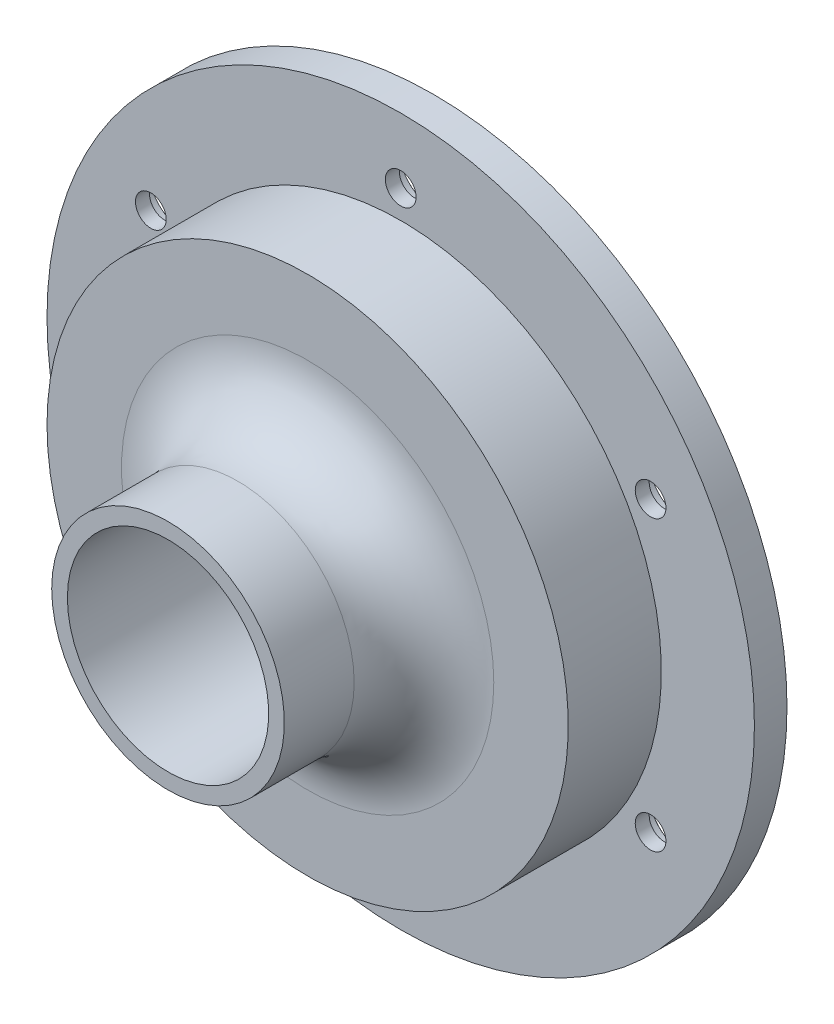
ISO-10303-21;
HEADER;
FILE_DESCRIPTION(('STEP AP214'),'2;1');
FILE_NAME('part.step','',(''),(''),'','','');
FILE_SCHEMA(('AUTOMOTIVE_DESIGN { 1 0 10303 214 1 1 1 1 }'));
ENDSEC;
DATA;
#1=APPLICATION_CONTEXT('core data for automotive mechanical design processes');
#2=APPLICATION_PROTOCOL_DEFINITION('international standard','automotive_design',2000,#1);
#3=PRODUCT_CONTEXT('',#1,'mechanical');
#4=PRODUCT('Part','Part','',(#3));
#5=PRODUCT_RELATED_PRODUCT_CATEGORY('part','',(#4));
#6=PRODUCT_DEFINITION_FORMATION('','',#4);
#7=PRODUCT_DEFINITION_CONTEXT('part definition',#1,'design');
#8=PRODUCT_DEFINITION('design','',#6,#7);
#9=PRODUCT_DEFINITION_SHAPE('','',#8);
#10=(LENGTH_UNIT() NAMED_UNIT(*) SI_UNIT(.MILLI.,.METRE.));
#11=(NAMED_UNIT(*) PLANE_ANGLE_UNIT() SI_UNIT($,.RADIAN.));
#12=(NAMED_UNIT(*) SI_UNIT($,.STERADIAN.) SOLID_ANGLE_UNIT());
#13=UNCERTAINTY_MEASURE_WITH_UNIT(LENGTH_MEASURE(1.E-05),#10,'distance_accuracy_value','');
#14=(GEOMETRIC_REPRESENTATION_CONTEXT(3) GLOBAL_UNCERTAINTY_ASSIGNED_CONTEXT((#13)) GLOBAL_UNIT_ASSIGNED_CONTEXT((#10,
#11,#12)) REPRESENTATION_CONTEXT('',''));
#15=CARTESIAN_POINT('',(0.,0.,0.));
#16=DIRECTION('',(0.,0.,1.));
#17=DIRECTION('',(1.,0.,0.));
#18=AXIS2_PLACEMENT_3D('',#15,#16,#17);
#19=CARTESIAN_POINT('',(-21.63,0.,0.));
#20=DIRECTION('',(0.,0.,-1.));
#21=DIRECTION('',(-1.,0.,0.));
#22=AXIS2_PLACEMENT_3D('',#19,#20,#21);
#23=PLANE('',#22);
#24=CARTESIAN_POINT('',(-53.6935750346348,31.0000000000006,0.));
#25=DIRECTION('',(0.,0.,-1.));
#26=DIRECTION('',(-1.,0.,0.));
#27=AXIS2_PLACEMENT_3D('',#24,#25,#26);
#28=CIRCLE('',#27,7.2985);
#29=CARTESIAN_POINT('',(-60.9920750346348,31.0000000000006,0.));
#30=VERTEX_POINT('',#29);
#31=EDGE_CURVE('E278',#30,#30,#28,.T.);
#32=ORIENTED_EDGE('',*,*,#31,.F.);
#33=EDGE_LOOP('',(#32));
#34=FACE_BOUND('',#33,.T.);
#35=CARTESIAN_POINT('',(-53.6935750346355,-30.9999999999995,0.));
#36=DIRECTION('',(0.,0.,-1.));
#37=DIRECTION('',(-1.,0.,0.));
#38=AXIS2_PLACEMENT_3D('',#35,#36,#37);
#39=CIRCLE('',#38,7.2985);
#40=CARTESIAN_POINT('',(-60.9920750346355,-30.9999999999995,0.));
#41=VERTEX_POINT('',#40);
#42=EDGE_CURVE('E288',#41,#41,#39,.T.);
#43=ORIENTED_EDGE('',*,*,#42,.F.);
#44=EDGE_LOOP('',(#43));
#45=FACE_BOUND('',#44,.T.);
#46=CARTESIAN_POINT('',(0.,-62.,0.));
#47=DIRECTION('',(0.,0.,-1.));
#48=DIRECTION('',(-1.,0.,0.));
#49=AXIS2_PLACEMENT_3D('',#46,#47,#48);
#50=CIRCLE('',#49,7.2985);
#51=CARTESIAN_POINT('',(-7.2985,-62.,0.));
#52=VERTEX_POINT('',#51);
#53=EDGE_CURVE('E69',#52,#52,#50,.T.);
#54=ORIENTED_EDGE('',*,*,#53,.F.);
#55=EDGE_LOOP('',(#54));
#56=FACE_BOUND('',#55,.T.);
#57=CARTESIAN_POINT('',(53.6935750346351,-31.0000000000003,0.));
#58=DIRECTION('',(0.,0.,-1.));
#59=DIRECTION('',(-1.,0.,0.));
#60=AXIS2_PLACEMENT_3D('',#57,#58,#59);
#61=CIRCLE('',#60,7.2985);
#62=CARTESIAN_POINT('',(46.3950750346351,-31.0000000000003,0.));
#63=VERTEX_POINT('',#62);
#64=EDGE_CURVE('E65',#63,#63,#61,.T.);
#65=ORIENTED_EDGE('',*,*,#64,.F.);
#66=EDGE_LOOP('',(#65));
#67=FACE_BOUND('',#66,.T.);
#68=CARTESIAN_POINT('',(53.6935750346353,30.9999999999999,0.));
#69=DIRECTION('',(0.,0.,-1.));
#70=DIRECTION('',(-1.,0.,0.));
#71=AXIS2_PLACEMENT_3D('',#68,#69,#70);
#72=CIRCLE('',#71,7.2985);
#73=CARTESIAN_POINT('',(46.3950750346353,30.9999999999999,0.));
#74=VERTEX_POINT('',#73);
#75=EDGE_CURVE('E61',#74,#74,#72,.T.);
#76=ORIENTED_EDGE('',*,*,#75,.F.);
#77=EDGE_LOOP('',(#76));
#78=FACE_BOUND('',#77,.T.);
#79=CARTESIAN_POINT('',(0.,62.,0.));
#80=DIRECTION('',(0.,0.,-1.));
#81=DIRECTION('',(-1.,0.,0.));
#82=AXIS2_PLACEMENT_3D('',#79,#80,#81);
#83=CIRCLE('',#82,7.2985);
#84=CARTESIAN_POINT('',(-7.2985,62.,0.));
#85=VERTEX_POINT('',#84);
#86=EDGE_CURVE('E56',#85,#85,#83,.T.);
#87=ORIENTED_EDGE('',*,*,#86,.F.);
#88=EDGE_LOOP('',(#87));
#89=FACE_BOUND('',#88,.T.);
#90=CARTESIAN_POINT('',(0.,0.,0.));
#91=DIRECTION('',(0.,0.,-1.));
#92=DIRECTION('',(-1.,0.,0.));
#93=AXIS2_PLACEMENT_3D('',#90,#91,#92);
#94=CIRCLE('',#93,76.0080645161291);
#95=CARTESIAN_POINT('',(-76.0080645161291,0.,0.));
#96=VERTEX_POINT('',#95);
#97=EDGE_CURVE('E44',#96,#96,#94,.T.);
#98=ORIENTED_EDGE('',*,*,#97,.T.);
#99=EDGE_LOOP('',(#98));
#100=FACE_BOUND('',#99,.T.);
#101=CARTESIAN_POINT('',(0.,0.,0.));
#102=DIRECTION('',(0.,0.,-1.));
#103=DIRECTION('',(-1.,0.,0.));
#104=AXIS2_PLACEMENT_3D('',#101,#102,#103);
#105=CIRCLE('',#104,21.63);
#106=CARTESIAN_POINT('',(-21.63,0.,0.));
#107=VERTEX_POINT('',#106);
#108=EDGE_CURVE('E51',#107,#107,#105,.T.);
#109=ORIENTED_EDGE('',*,*,#108,.F.);
#110=EDGE_LOOP('',(#109));
#111=FACE_BOUND('',#110,.T.);
#112=ADVANCED_FACE('F31',(#34,#45,#56,#67,#78,#89,#100,#111),#23,.T.);
#113=CARTESIAN_POINT('',(0.,0.,0.));
#114=DIRECTION('',(0.,0.,-1.));
#115=DIRECTION('',(-1.,0.,0.));
#116=AXIS2_PLACEMENT_3D('',#113,#114,#115);
#117=CYLINDRICAL_SURFACE('',#116,76.0080645161291);
#118=CARTESIAN_POINT('',(0.,0.,7.));
#119=DIRECTION('',(0.,0.,-1.));
#120=DIRECTION('',(-1.,0.,0.));
#121=AXIS2_PLACEMENT_3D('',#118,#119,#120);
#122=CIRCLE('',#121,76.0080645161291);
#123=CARTESIAN_POINT('',(-76.0080645161291,0.,7.));
#124=VERTEX_POINT('',#123);
#125=EDGE_CURVE('E137',#124,#124,#122,.T.);
#126=ORIENTED_EDGE('',*,*,#125,.T.);
#127=EDGE_LOOP('',(#126));
#128=FACE_BOUND('',#127,.T.);
#129=ORIENTED_EDGE('',*,*,#97,.F.);
#130=EDGE_LOOP('',(#129));
#131=FACE_BOUND('',#130,.T.);
#132=ADVANCED_FACE('F144',(#128,#131),#117,.T.);
#133=CARTESIAN_POINT('',(-76.0080645161291,0.,7.));
#134=DIRECTION('',(0.,0.,1.));
#135=DIRECTION('',(1.,0.,0.));
#136=AXIS2_PLACEMENT_3D('',#133,#134,#135);
#137=PLANE('',#136);
#138=CARTESIAN_POINT('',(-53.6935750346348,31.0000000000006,7.));
#139=DIRECTION('',(0.,0.,1.));
#140=DIRECTION('',(1.,0.,0.));
#141=AXIS2_PLACEMENT_3D('',#138,#139,#140);
#142=CIRCLE('',#141,3.29999999999999);
#143=CARTESIAN_POINT('',(-50.3935750346348,31.0000000000006,7.));
#144=VERTEX_POINT('',#143);
#145=EDGE_CURVE('E35',#144,#144,#142,.T.);
#146=ORIENTED_EDGE('',*,*,#145,.F.);
#147=EDGE_LOOP('',(#146));
#148=FACE_BOUND('',#147,.T.);
#149=CARTESIAN_POINT('',(-53.6935750346355,-30.9999999999995,7.));
#150=DIRECTION('',(0.,0.,1.));
#151=DIRECTION('',(1.,0.,0.));
#152=AXIS2_PLACEMENT_3D('',#149,#150,#151);
#153=CIRCLE('',#152,3.29999999999999);
#154=CARTESIAN_POINT('',(-50.3935750346355,-30.9999999999995,7.));
#155=VERTEX_POINT('',#154);
#156=EDGE_CURVE('E67',#155,#155,#153,.T.);
#157=ORIENTED_EDGE('',*,*,#156,.F.);
#158=EDGE_LOOP('',(#157));
#159=FACE_BOUND('',#158,.T.);
#160=CARTESIAN_POINT('',(0.,-62.,7.));
#161=DIRECTION('',(0.,0.,1.));
#162=DIRECTION('',(1.,0.,0.));
#163=AXIS2_PLACEMENT_3D('',#160,#161,#162);
#164=CIRCLE('',#163,3.29999999999999);
#165=CARTESIAN_POINT('',(3.29999999999999,-62.,7.));
#166=VERTEX_POINT('',#165);
#167=EDGE_CURVE('E63',#166,#166,#164,.T.);
#168=ORIENTED_EDGE('',*,*,#167,.F.);
#169=EDGE_LOOP('',(#168));
#170=FACE_BOUND('',#169,.T.);
#171=CARTESIAN_POINT('',(53.6935750346351,-31.0000000000003,7.));
#172=DIRECTION('',(0.,0.,1.));
#173=DIRECTION('',(1.,0.,0.));
#174=AXIS2_PLACEMENT_3D('',#171,#172,#173);
#175=CIRCLE('',#174,3.29999999999999);
#176=CARTESIAN_POINT('',(56.9935750346351,-31.0000000000003,7.));
#177=VERTEX_POINT('',#176);
#178=EDGE_CURVE('E58',#177,#177,#175,.T.);
#179=ORIENTED_EDGE('',*,*,#178,.F.);
#180=EDGE_LOOP('',(#179));
#181=FACE_BOUND('',#180,.T.);
#182=CARTESIAN_POINT('',(53.6935750346353,30.9999999999999,7.));
#183=DIRECTION('',(0.,0.,1.));
#184=DIRECTION('',(1.,0.,0.));
#185=AXIS2_PLACEMENT_3D('',#182,#183,#184);
#186=CIRCLE('',#185,3.29999999999999);
#187=CARTESIAN_POINT('',(56.9935750346353,30.9999999999999,7.));
#188=VERTEX_POINT('',#187);
#189=EDGE_CURVE('E53',#188,#188,#186,.T.);
#190=ORIENTED_EDGE('',*,*,#189,.F.);
#191=EDGE_LOOP('',(#190));
#192=FACE_BOUND('',#191,.T.);
#193=CARTESIAN_POINT('',(0.,62.,7.));
#194=DIRECTION('',(0.,0.,1.));
#195=DIRECTION('',(1.,0.,0.));
#196=AXIS2_PLACEMENT_3D('',#193,#194,#195);
#197=CIRCLE('',#196,3.29999999999999);
#198=CARTESIAN_POINT('',(3.29999999999999,62.,7.));
#199=VERTEX_POINT('',#198);
#200=EDGE_CURVE('E48',#199,#199,#197,.T.);
#201=ORIENTED_EDGE('',*,*,#200,.F.);
#202=EDGE_LOOP('',(#201));
#203=FACE_BOUND('',#202,.T.);
#204=CARTESIAN_POINT('',(0.,0.,7.));
#205=DIRECTION('',(0.,0.,-1.));
#206=DIRECTION('',(-1.,0.,0.));
#207=AXIS2_PLACEMENT_3D('',#204,#205,#206);
#208=CIRCLE('',#207,56.0080645161291);
#209=CARTESIAN_POINT('',(-56.0080645161291,0.,7.));
#210=VERTEX_POINT('',#209);
#211=EDGE_CURVE('E134',#210,#210,#208,.T.);
#212=ORIENTED_EDGE('',*,*,#211,.T.);
#213=EDGE_LOOP('',(#212));
#214=FACE_BOUND('',#213,.T.);
#215=ORIENTED_EDGE('',*,*,#125,.F.);
#216=EDGE_LOOP('',(#215));
#217=FACE_BOUND('',#216,.T.);
#218=ADVANCED_FACE('F146',(#148,#159,#170,#181,#192,#203,#214,#217),#137,.T.);
#219=CARTESIAN_POINT('',(0.,0.,0.));
#220=DIRECTION('',(0.,0.,-1.));
#221=DIRECTION('',(-1.,0.,0.));
#222=AXIS2_PLACEMENT_3D('',#219,#220,#221);
#223=CYLINDRICAL_SURFACE('',#222,56.0080645161291);
#224=CARTESIAN_POINT('',(0.,0.,27.));
#225=DIRECTION('',(0.,0.,-1.));
#226=DIRECTION('',(-1.,0.,0.));
#227=AXIS2_PLACEMENT_3D('',#224,#225,#226);
#228=CIRCLE('',#227,56.008064516129);
#229=CARTESIAN_POINT('',(-56.008064516129,0.,27.));
#230=VERTEX_POINT('',#229);
#231=EDGE_CURVE('E131',#230,#230,#228,.T.);
#232=ORIENTED_EDGE('',*,*,#231,.T.);
#233=EDGE_LOOP('',(#232));
#234=FACE_BOUND('',#233,.T.);
#235=ORIENTED_EDGE('',*,*,#211,.F.);
#236=EDGE_LOOP('',(#235));
#237=FACE_BOUND('',#236,.T.);
#238=ADVANCED_FACE('F153',(#234,#237),#223,.T.);
#239=CARTESIAN_POINT('',(-56.008064516129,0.,27.));
#240=DIRECTION('',(0.,0.,1.));
#241=DIRECTION('',(1.,0.,0.));
#242=AXIS2_PLACEMENT_3D('',#239,#240,#241);
#243=PLANE('',#242);
#244=CARTESIAN_POINT('',(0.,0.,27.));
#245=DIRECTION('',(0.,0.,1.));
#246=DIRECTION('',(1.,0.,0.));
#247=AXIS2_PLACEMENT_3D('',#244,#245,#246);
#248=CIRCLE('',#247,40.);
#249=CARTESIAN_POINT('',(40.,0.,27.));
#250=VERTEX_POINT('',#249);
#251=EDGE_CURVE('E39',#250,#250,#248,.F.);
#252=ORIENTED_EDGE('',*,*,#251,.T.);
#253=EDGE_LOOP('',(#252));
#254=FACE_BOUND('',#253,.T.);
#255=ORIENTED_EDGE('',*,*,#231,.F.);
#256=EDGE_LOOP('',(#255));
#257=FACE_BOUND('',#256,.T.);
#258=ADVANCED_FACE('F160',(#254,#257),#243,.T.);
#259=CARTESIAN_POINT('',(0.,0.,0.));
#260=DIRECTION('',(0.,0.,-1.));
#261=DIRECTION('',(-1.,0.,0.));
#262=AXIS2_PLACEMENT_3D('',#259,#260,#261);
#263=CYLINDRICAL_SURFACE('',#262,25.);
#264=CARTESIAN_POINT('',(0.,0.,42.));
#265=DIRECTION('',(0.,0.,1.));
#266=DIRECTION('',(1.,0.,0.));
#267=AXIS2_PLACEMENT_3D('',#264,#265,#266);
#268=CIRCLE('',#267,25.);
#269=CARTESIAN_POINT('',(25.,0.,42.));
#270=VERTEX_POINT('',#269);
#271=EDGE_CURVE('E10',#270,#270,#268,.T.);
#272=ORIENTED_EDGE('',*,*,#271,.T.);
#273=EDGE_LOOP('',(#272));
#274=FACE_BOUND('',#273,.T.);
#275=CARTESIAN_POINT('',(0.,0.,57.));
#276=DIRECTION('',(0.,0.,-1.));
#277=DIRECTION('',(-1.,0.,0.));
#278=AXIS2_PLACEMENT_3D('',#275,#276,#277);
#279=CIRCLE('',#278,25.);
#280=CARTESIAN_POINT('',(-25.,0.,57.));
#281=VERTEX_POINT('',#280);
#282=EDGE_CURVE('E128',#281,#281,#279,.T.);
#283=ORIENTED_EDGE('',*,*,#282,.T.);
#284=EDGE_LOOP('',(#283));
#285=FACE_BOUND('',#284,.T.);
#286=ADVANCED_FACE('F164',(#274,#285),#263,.T.);
#287=CARTESIAN_POINT('',(-25.,0.,57.));
#288=DIRECTION('',(0.,0.,1.));
#289=DIRECTION('',(1.,0.,0.));
#290=AXIS2_PLACEMENT_3D('',#287,#288,#289);
#291=PLANE('',#290);
#292=CARTESIAN_POINT('',(0.,0.,57.));
#293=DIRECTION('',(0.,0.,-1.));
#294=DIRECTION('',(-1.,0.,0.));
#295=AXIS2_PLACEMENT_3D('',#292,#293,#294);
#296=CIRCLE('',#295,21.63);
#297=CARTESIAN_POINT('',(-21.63,0.,57.));
#298=VERTEX_POINT('',#297);
#299=EDGE_CURVE('E125',#298,#298,#296,.T.);
#300=ORIENTED_EDGE('',*,*,#299,.T.);
#301=EDGE_LOOP('',(#300));
#302=FACE_BOUND('',#301,.T.);
#303=ORIENTED_EDGE('',*,*,#282,.F.);
#304=EDGE_LOOP('',(#303));
#305=FACE_BOUND('',#304,.T.);
#306=ADVANCED_FACE('F168',(#302,#305),#291,.T.);
#307=CARTESIAN_POINT('',(0.,0.,0.));
#308=DIRECTION('',(0.,0.,-1.));
#309=DIRECTION('',(-1.,0.,0.));
#310=AXIS2_PLACEMENT_3D('',#307,#308,#309);
#311=CYLINDRICAL_SURFACE('',#310,21.63);
#312=ORIENTED_EDGE('',*,*,#108,.T.);
#313=EDGE_LOOP('',(#312));
#314=FACE_BOUND('',#313,.T.);
#315=ORIENTED_EDGE('',*,*,#299,.F.);
#316=EDGE_LOOP('',(#315));
#317=FACE_BOUND('',#316,.T.);
#318=ADVANCED_FACE('F171',(#314,#317),#311,.F.);
#319=CARTESIAN_POINT('',(0.,0.,42.));
#320=DIRECTION('',(0.,0.,1.));
#321=DIRECTION('',(1.,0.,0.));
#322=AXIS2_PLACEMENT_3D('',#319,#320,#321);
#323=TOROIDAL_SURFACE('',#322,40.,15.);
#324=ORIENTED_EDGE('',*,*,#271,.F.);
#325=EDGE_LOOP('',(#324));
#326=FACE_BOUND('',#325,.T.);
#327=ORIENTED_EDGE('',*,*,#251,.F.);
#328=EDGE_LOOP('',(#327));
#329=FACE_BOUND('',#328,.T.);
#330=ADVANCED_FACE('F33',(#326,#329),#323,.F.);
#331=CARTESIAN_POINT('',(0.,62.,0.));
#332=DIRECTION('',(0.,0.,-1.));
#333=DIRECTION('',(-1.,0.,0.));
#334=AXIS2_PLACEMENT_3D('',#331,#332,#333);
#335=CYLINDRICAL_SURFACE('',#334,3.29999999999999);
#336=ORIENTED_EDGE('',*,*,#200,.T.);
#337=EDGE_LOOP('',(#336));
#338=FACE_BOUND('',#337,.T.);
#339=CARTESIAN_POINT('',(0.,62.,4.));
#340=DIRECTION('',(0.,0.,-1.));
#341=DIRECTION('',(-1.,0.,0.));
#342=AXIS2_PLACEMENT_3D('',#339,#340,#341);
#343=CIRCLE('',#342,3.3);
#344=CARTESIAN_POINT('',(-3.3,62.,4.));
#345=VERTEX_POINT('',#344);
#346=EDGE_CURVE('E52',#345,#345,#343,.T.);
#347=ORIENTED_EDGE('',*,*,#346,.T.);
#348=EDGE_LOOP('',(#347));
#349=FACE_BOUND('',#348,.T.);
#350=ADVANCED_FACE('F176',(#338,#349),#335,.F.);
#351=CARTESIAN_POINT('',(7.2735,62.,4.));
#352=DIRECTION('',(0.,0.,1.));
#353=DIRECTION('',(1.,0.,0.));
#354=AXIS2_PLACEMENT_3D('',#351,#352,#353);
#355=PLANE('',#354);
#356=ORIENTED_EDGE('',*,*,#346,.F.);
#357=EDGE_LOOP('',(#356));
#358=FACE_BOUND('',#357,.T.);
#359=CARTESIAN_POINT('',(0.,62.,4.));
#360=DIRECTION('',(0.,0.,-1.));
#361=DIRECTION('',(-1.,0.,0.));
#362=AXIS2_PLACEMENT_3D('',#359,#360,#361);
#363=CIRCLE('',#362,7.2735);
#364=CARTESIAN_POINT('',(-7.2735,62.,4.));
#365=VERTEX_POINT('',#364);
#366=EDGE_CURVE('E118',#365,#365,#363,.T.);
#367=ORIENTED_EDGE('',*,*,#366,.T.);
#368=EDGE_LOOP('',(#367));
#369=FACE_BOUND('',#368,.T.);
#370=ADVANCED_FACE('F179',(#358,#369),#355,.F.);
#371=CARTESIAN_POINT('',(0.,62.,0.));
#372=DIRECTION('',(0.,0.,-1.));
#373=DIRECTION('',(-1.,0.,0.));
#374=AXIS2_PLACEMENT_3D('',#371,#372,#373);
#375=CYLINDRICAL_SURFACE('',#374,7.2735);
#376=ORIENTED_EDGE('',*,*,#366,.F.);
#377=EDGE_LOOP('',(#376));
#378=FACE_BOUND('',#377,.T.);
#379=CARTESIAN_POINT('',(0.,62.,0.0250000000000017));
#380=DIRECTION('',(0.,0.,-1.));
#381=DIRECTION('',(-1.,0.,0.));
#382=AXIS2_PLACEMENT_3D('',#379,#380,#381);
#383=CIRCLE('',#382,7.2735);
#384=CARTESIAN_POINT('',(-7.2735,62.,0.0250000000000017));
#385=VERTEX_POINT('',#384);
#386=EDGE_CURVE('E115',#385,#385,#383,.T.);
#387=ORIENTED_EDGE('',*,*,#386,.T.);
#388=EDGE_LOOP('',(#387));
#389=FACE_BOUND('',#388,.T.);
#390=ADVANCED_FACE('F183',(#378,#389),#375,.F.);
#391=CARTESIAN_POINT('',(0.,62.,0.));
#392=DIRECTION('',(0.,0.,-1.));
#393=DIRECTION('',(-1.,0.,0.));
#394=AXIS2_PLACEMENT_3D('',#391,#392,#393);
#395=CONICAL_SURFACE('',#394,7.2985,0.785398163397377);
#396=ORIENTED_EDGE('',*,*,#386,.F.);
#397=EDGE_LOOP('',(#396));
#398=FACE_BOUND('',#397,.T.);
#399=ORIENTED_EDGE('',*,*,#86,.T.);
#400=EDGE_LOOP('',(#399));
#401=FACE_BOUND('',#400,.T.);
#402=ADVANCED_FACE('F187',(#398,#401),#395,.F.);
#403=CARTESIAN_POINT('',(53.6935750346353,30.9999999999999,0.));
#404=DIRECTION('',(0.,0.,-1.));
#405=DIRECTION('',(-1.,0.,0.));
#406=AXIS2_PLACEMENT_3D('',#403,#404,#405);
#407=CYLINDRICAL_SURFACE('',#406,3.29999999999999);
#408=ORIENTED_EDGE('',*,*,#189,.T.);
#409=EDGE_LOOP('',(#408));
#410=FACE_BOUND('',#409,.T.);
#411=CARTESIAN_POINT('',(53.6935750346353,30.9999999999999,4.));
#412=DIRECTION('',(0.,0.,-1.));
#413=DIRECTION('',(-1.,0.,0.));
#414=AXIS2_PLACEMENT_3D('',#411,#412,#413);
#415=CIRCLE('',#414,3.3);
#416=CARTESIAN_POINT('',(50.3935750346353,30.9999999999999,4.));
#417=VERTEX_POINT('',#416);
#418=EDGE_CURVE('E57',#417,#417,#415,.T.);
#419=ORIENTED_EDGE('',*,*,#418,.T.);
#420=EDGE_LOOP('',(#419));
#421=FACE_BOUND('',#420,.T.);
#422=ADVANCED_FACE('F191',(#410,#421),#407,.F.);
#423=CARTESIAN_POINT('',(60.9670750346353,30.9999999999999,4.));
#424=DIRECTION('',(0.,0.,1.));
#425=DIRECTION('',(1.,0.,0.));
#426=AXIS2_PLACEMENT_3D('',#423,#424,#425);
#427=PLANE('',#426);
#428=ORIENTED_EDGE('',*,*,#418,.F.);
#429=EDGE_LOOP('',(#428));
#430=FACE_BOUND('',#429,.T.);
#431=CARTESIAN_POINT('',(53.6935750346353,30.9999999999999,4.));
#432=DIRECTION('',(0.,0.,-1.));
#433=DIRECTION('',(-1.,0.,0.));
#434=AXIS2_PLACEMENT_3D('',#431,#432,#433);
#435=CIRCLE('',#434,7.27349999999999);
#436=CARTESIAN_POINT('',(46.4200750346353,30.9999999999999,4.));
#437=VERTEX_POINT('',#436);
#438=EDGE_CURVE('E108',#437,#437,#435,.T.);
#439=ORIENTED_EDGE('',*,*,#438,.T.);
#440=EDGE_LOOP('',(#439));
#441=FACE_BOUND('',#440,.T.);
#442=ADVANCED_FACE('F195',(#430,#441),#427,.F.);
#443=CARTESIAN_POINT('',(53.6935750346353,30.9999999999999,0.));
#444=DIRECTION('',(0.,0.,-1.));
#445=DIRECTION('',(-1.,0.,0.));
#446=AXIS2_PLACEMENT_3D('',#443,#444,#445);
#447=CYLINDRICAL_SURFACE('',#446,7.27349999999999);
#448=ORIENTED_EDGE('',*,*,#438,.F.);
#449=EDGE_LOOP('',(#448));
#450=FACE_BOUND('',#449,.T.);
#451=CARTESIAN_POINT('',(53.6935750346353,30.9999999999999,0.0250000000000017));
#452=DIRECTION('',(0.,0.,-1.));
#453=DIRECTION('',(-1.,0.,0.));
#454=AXIS2_PLACEMENT_3D('',#451,#452,#453);
#455=CIRCLE('',#454,7.27349999999999);
#456=CARTESIAN_POINT('',(46.4200750346353,30.9999999999999,0.0250000000000017));
#457=VERTEX_POINT('',#456);
#458=EDGE_CURVE('E105',#457,#457,#455,.T.);
#459=ORIENTED_EDGE('',*,*,#458,.T.);
#460=EDGE_LOOP('',(#459));
#461=FACE_BOUND('',#460,.T.);
#462=ADVANCED_FACE('F199',(#450,#461),#447,.F.);
#463=CARTESIAN_POINT('',(53.6935750346353,30.9999999999999,0.));
#464=DIRECTION('',(0.,0.,-1.));
#465=DIRECTION('',(-1.,0.,0.));
#466=AXIS2_PLACEMENT_3D('',#463,#464,#465);
#467=CONICAL_SURFACE('',#466,7.2985,0.785398163397446);
#468=ORIENTED_EDGE('',*,*,#458,.F.);
#469=EDGE_LOOP('',(#468));
#470=FACE_BOUND('',#469,.T.);
#471=ORIENTED_EDGE('',*,*,#75,.T.);
#472=EDGE_LOOP('',(#471));
#473=FACE_BOUND('',#472,.T.);
#474=ADVANCED_FACE('F203',(#470,#473),#467,.F.);
#475=CARTESIAN_POINT('',(53.6935750346351,-31.0000000000003,0.));
#476=DIRECTION('',(0.,0.,-1.));
#477=DIRECTION('',(-1.,0.,0.));
#478=AXIS2_PLACEMENT_3D('',#475,#476,#477);
#479=CYLINDRICAL_SURFACE('',#478,3.29999999999999);
#480=ORIENTED_EDGE('',*,*,#178,.T.);
#481=EDGE_LOOP('',(#480));
#482=FACE_BOUND('',#481,.T.);
#483=CARTESIAN_POINT('',(53.6935750346351,-31.0000000000003,4.));
#484=DIRECTION('',(0.,0.,-1.));
#485=DIRECTION('',(-1.,0.,0.));
#486=AXIS2_PLACEMENT_3D('',#483,#484,#485);
#487=CIRCLE('',#486,3.3);
#488=CARTESIAN_POINT('',(50.3935750346351,-31.0000000000003,4.));
#489=VERTEX_POINT('',#488);
#490=EDGE_CURVE('E62',#489,#489,#487,.T.);
#491=ORIENTED_EDGE('',*,*,#490,.T.);
#492=EDGE_LOOP('',(#491));
#493=FACE_BOUND('',#492,.T.);
#494=ADVANCED_FACE('F207',(#482,#493),#479,.F.);
#495=CARTESIAN_POINT('',(60.9670750346351,-31.0000000000003,4.));
#496=DIRECTION('',(0.,0.,1.));
#497=DIRECTION('',(1.,0.,0.));
#498=AXIS2_PLACEMENT_3D('',#495,#496,#497);
#499=PLANE('',#498);
#500=ORIENTED_EDGE('',*,*,#490,.F.);
#501=EDGE_LOOP('',(#500));
#502=FACE_BOUND('',#501,.T.);
#503=CARTESIAN_POINT('',(53.6935750346351,-31.0000000000003,4.));
#504=DIRECTION('',(0.,0.,-1.));
#505=DIRECTION('',(-1.,0.,0.));
#506=AXIS2_PLACEMENT_3D('',#503,#504,#505);
#507=CIRCLE('',#506,7.27349999999999);
#508=CARTESIAN_POINT('',(46.4200750346351,-31.0000000000003,4.));
#509=VERTEX_POINT('',#508);
#510=EDGE_CURVE('E98',#509,#509,#507,.T.);
#511=ORIENTED_EDGE('',*,*,#510,.T.);
#512=EDGE_LOOP('',(#511));
#513=FACE_BOUND('',#512,.T.);
#514=ADVANCED_FACE('F211',(#502,#513),#499,.F.);
#515=CARTESIAN_POINT('',(53.6935750346351,-31.0000000000003,0.));
#516=DIRECTION('',(0.,0.,-1.));
#517=DIRECTION('',(-1.,0.,0.));
#518=AXIS2_PLACEMENT_3D('',#515,#516,#517);
#519=CYLINDRICAL_SURFACE('',#518,7.27349999999999);
#520=ORIENTED_EDGE('',*,*,#510,.F.);
#521=EDGE_LOOP('',(#520));
#522=FACE_BOUND('',#521,.T.);
#523=CARTESIAN_POINT('',(53.6935750346351,-31.0000000000003,0.0250000000000017));
#524=DIRECTION('',(0.,0.,-1.));
#525=DIRECTION('',(-1.,0.,0.));
#526=AXIS2_PLACEMENT_3D('',#523,#524,#525);
#527=CIRCLE('',#526,7.27349999999999);
#528=CARTESIAN_POINT('',(46.4200750346351,-31.0000000000003,0.0250000000000017));
#529=VERTEX_POINT('',#528);
#530=EDGE_CURVE('E95',#529,#529,#527,.T.);
#531=ORIENTED_EDGE('',*,*,#530,.T.);
#532=EDGE_LOOP('',(#531));
#533=FACE_BOUND('',#532,.T.);
#534=ADVANCED_FACE('F215',(#522,#533),#519,.F.);
#535=CARTESIAN_POINT('',(53.6935750346351,-31.0000000000003,0.));
#536=DIRECTION('',(0.,0.,-1.));
#537=DIRECTION('',(-1.,0.,0.));
#538=AXIS2_PLACEMENT_3D('',#535,#536,#537);
#539=CONICAL_SURFACE('',#538,7.2985,0.785398163397446);
#540=ORIENTED_EDGE('',*,*,#530,.F.);
#541=EDGE_LOOP('',(#540));
#542=FACE_BOUND('',#541,.T.);
#543=ORIENTED_EDGE('',*,*,#64,.T.);
#544=EDGE_LOOP('',(#543));
#545=FACE_BOUND('',#544,.T.);
#546=ADVANCED_FACE('F219',(#542,#545),#539,.F.);
#547=CARTESIAN_POINT('',(0.,-62.,0.));
#548=DIRECTION('',(0.,0.,-1.));
#549=DIRECTION('',(-1.,0.,0.));
#550=AXIS2_PLACEMENT_3D('',#547,#548,#549);
#551=CYLINDRICAL_SURFACE('',#550,3.29999999999999);
#552=ORIENTED_EDGE('',*,*,#167,.T.);
#553=EDGE_LOOP('',(#552));
#554=FACE_BOUND('',#553,.T.);
#555=CARTESIAN_POINT('',(0.,-62.,4.));
#556=DIRECTION('',(0.,0.,-1.));
#557=DIRECTION('',(-1.,0.,0.));
#558=AXIS2_PLACEMENT_3D('',#555,#556,#557);
#559=CIRCLE('',#558,3.3);
#560=CARTESIAN_POINT('',(-3.3,-62.,4.));
#561=VERTEX_POINT('',#560);
#562=EDGE_CURVE('E66',#561,#561,#559,.T.);
#563=ORIENTED_EDGE('',*,*,#562,.T.);
#564=EDGE_LOOP('',(#563));
#565=FACE_BOUND('',#564,.T.);
#566=ADVANCED_FACE('F223',(#554,#565),#551,.F.);
#567=CARTESIAN_POINT('',(7.2735,-62.,4.));
#568=DIRECTION('',(0.,0.,1.));
#569=DIRECTION('',(1.,0.,0.));
#570=AXIS2_PLACEMENT_3D('',#567,#568,#569);
#571=PLANE('',#570);
#572=ORIENTED_EDGE('',*,*,#562,.F.);
#573=EDGE_LOOP('',(#572));
#574=FACE_BOUND('',#573,.T.);
#575=CARTESIAN_POINT('',(0.,-62.,4.));
#576=DIRECTION('',(0.,0.,-1.));
#577=DIRECTION('',(-1.,0.,0.));
#578=AXIS2_PLACEMENT_3D('',#575,#576,#577);
#579=CIRCLE('',#578,7.2735);
#580=CARTESIAN_POINT('',(-7.2735,-62.,4.));
#581=VERTEX_POINT('',#580);
#582=EDGE_CURVE('E88',#581,#581,#579,.T.);
#583=ORIENTED_EDGE('',*,*,#582,.T.);
#584=EDGE_LOOP('',(#583));
#585=FACE_BOUND('',#584,.T.);
#586=ADVANCED_FACE('F227',(#574,#585),#571,.F.);
#587=CARTESIAN_POINT('',(0.,-62.,0.));
#588=DIRECTION('',(0.,0.,-1.));
#589=DIRECTION('',(-1.,0.,0.));
#590=AXIS2_PLACEMENT_3D('',#587,#588,#589);
#591=CYLINDRICAL_SURFACE('',#590,7.2735);
#592=ORIENTED_EDGE('',*,*,#582,.F.);
#593=EDGE_LOOP('',(#592));
#594=FACE_BOUND('',#593,.T.);
#595=CARTESIAN_POINT('',(0.,-62.,0.0250000000000017));
#596=DIRECTION('',(0.,0.,-1.));
#597=DIRECTION('',(-1.,0.,0.));
#598=AXIS2_PLACEMENT_3D('',#595,#596,#597);
#599=CIRCLE('',#598,7.2735);
#600=CARTESIAN_POINT('',(-7.2735,-62.,0.0250000000000017));
#601=VERTEX_POINT('',#600);
#602=EDGE_CURVE('E74',#601,#601,#599,.T.);
#603=ORIENTED_EDGE('',*,*,#602,.T.);
#604=EDGE_LOOP('',(#603));
#605=FACE_BOUND('',#604,.T.);
#606=ADVANCED_FACE('F231',(#594,#605),#591,.F.);
#607=CARTESIAN_POINT('',(0.,-62.,0.));
#608=DIRECTION('',(0.,0.,-1.));
#609=DIRECTION('',(-1.,0.,0.));
#610=AXIS2_PLACEMENT_3D('',#607,#608,#609);
#611=CONICAL_SURFACE('',#610,7.2985,0.785398163397377);
#612=ORIENTED_EDGE('',*,*,#602,.F.);
#613=EDGE_LOOP('',(#612));
#614=FACE_BOUND('',#613,.T.);
#615=ORIENTED_EDGE('',*,*,#53,.T.);
#616=EDGE_LOOP('',(#615));
#617=FACE_BOUND('',#616,.T.);
#618=ADVANCED_FACE('F235',(#614,#617),#611,.F.);
#619=CARTESIAN_POINT('',(-53.6935750346355,-30.9999999999995,0.));
#620=DIRECTION('',(0.,0.,-1.));
#621=DIRECTION('',(-1.,0.,0.));
#622=AXIS2_PLACEMENT_3D('',#619,#620,#621);
#623=CYLINDRICAL_SURFACE('',#622,3.29999999999999);
#624=ORIENTED_EDGE('',*,*,#156,.T.);
#625=EDGE_LOOP('',(#624));
#626=FACE_BOUND('',#625,.T.);
#627=CARTESIAN_POINT('',(-53.6935750346355,-30.9999999999995,4.));
#628=DIRECTION('',(0.,0.,-1.));
#629=DIRECTION('',(-1.,0.,0.));
#630=AXIS2_PLACEMENT_3D('',#627,#628,#629);
#631=CIRCLE('',#630,3.3);
#632=CARTESIAN_POINT('',(-56.9935750346355,-30.9999999999995,4.));
#633=VERTEX_POINT('',#632);
#634=EDGE_CURVE('E70',#633,#633,#631,.T.);
#635=ORIENTED_EDGE('',*,*,#634,.T.);
#636=EDGE_LOOP('',(#635));
#637=FACE_BOUND('',#636,.T.);
#638=ADVANCED_FACE('F239',(#626,#637),#623,.F.);
#639=CARTESIAN_POINT('',(-46.4200750346355,-30.9999999999995,4.));
#640=DIRECTION('',(0.,0.,1.));
#641=DIRECTION('',(1.,0.,0.));
#642=AXIS2_PLACEMENT_3D('',#639,#640,#641);
#643=PLANE('',#642);
#644=ORIENTED_EDGE('',*,*,#634,.F.);
#645=EDGE_LOOP('',(#644));
#646=FACE_BOUND('',#645,.T.);
#647=CARTESIAN_POINT('',(-53.6935750346355,-30.9999999999995,4.));
#648=DIRECTION('',(0.,0.,-1.));
#649=DIRECTION('',(-1.,0.,0.));
#650=AXIS2_PLACEMENT_3D('',#647,#648,#649);
#651=CIRCLE('',#650,7.27349999999999);
#652=CARTESIAN_POINT('',(-60.9670750346355,-30.9999999999995,4.));
#653=VERTEX_POINT('',#652);
#654=EDGE_CURVE('E77',#653,#653,#651,.T.);
#655=ORIENTED_EDGE('',*,*,#654,.T.);
#656=EDGE_LOOP('',(#655));
#657=FACE_BOUND('',#656,.T.);
#658=ADVANCED_FACE('F243',(#646,#657),#643,.F.);
#659=CARTESIAN_POINT('',(-53.6935750346355,-30.9999999999995,0.));
#660=DIRECTION('',(0.,0.,-1.));
#661=DIRECTION('',(-1.,0.,0.));
#662=AXIS2_PLACEMENT_3D('',#659,#660,#661);
#663=CYLINDRICAL_SURFACE('',#662,7.2735);
#664=ORIENTED_EDGE('',*,*,#654,.F.);
#665=EDGE_LOOP('',(#664));
#666=FACE_BOUND('',#665,.T.);
#667=CARTESIAN_POINT('',(-53.6935750346355,-30.9999999999995,0.0250000000000017));
#668=DIRECTION('',(0.,0.,-1.));
#669=DIRECTION('',(-1.,0.,0.));
#670=AXIS2_PLACEMENT_3D('',#667,#668,#669);
#671=CIRCLE('',#670,7.2735);
#672=CARTESIAN_POINT('',(-60.9670750346355,-30.9999999999995,0.0250000000000017));
#673=VERTEX_POINT('',#672);
#674=EDGE_CURVE('E82',#673,#673,#671,.T.);
#675=ORIENTED_EDGE('',*,*,#674,.T.);
#676=EDGE_LOOP('',(#675));
#677=FACE_BOUND('',#676,.T.);
#678=ADVANCED_FACE('F246',(#666,#677),#663,.F.);
#679=CARTESIAN_POINT('',(-53.6935750346355,-30.9999999999995,0.));
#680=DIRECTION('',(0.,0.,-1.));
#681=DIRECTION('',(-1.,0.,0.));
#682=AXIS2_PLACEMENT_3D('',#679,#680,#681);
#683=CONICAL_SURFACE('',#682,7.2985,0.785398163397308);
#684=ORIENTED_EDGE('',*,*,#674,.F.);
#685=EDGE_LOOP('',(#684));
#686=FACE_BOUND('',#685,.T.);
#687=ORIENTED_EDGE('',*,*,#42,.T.);
#688=EDGE_LOOP('',(#687));
#689=FACE_BOUND('',#688,.T.);
#690=ADVANCED_FACE('F250',(#686,#689),#683,.F.);
#691=CARTESIAN_POINT('',(-53.6935750346348,31.0000000000006,0.));
#692=DIRECTION('',(0.,0.,-1.));
#693=DIRECTION('',(-1.,0.,0.));
#694=AXIS2_PLACEMENT_3D('',#691,#692,#693);
#695=CYLINDRICAL_SURFACE('',#694,3.29999999999999);
#696=ORIENTED_EDGE('',*,*,#145,.T.);
#697=EDGE_LOOP('',(#696));
#698=FACE_BOUND('',#697,.T.);
#699=CARTESIAN_POINT('',(-53.6935750346348,31.0000000000006,4.));
#700=DIRECTION('',(0.,0.,-1.));
#701=DIRECTION('',(-1.,0.,0.));
#702=AXIS2_PLACEMENT_3D('',#699,#700,#701);
#703=CIRCLE('',#702,3.3);
#704=CARTESIAN_POINT('',(-56.9935750346348,31.0000000000006,4.));
#705=VERTEX_POINT('',#704);
#706=EDGE_CURVE('E285',#705,#705,#703,.T.);
#707=ORIENTED_EDGE('',*,*,#706,.T.);
#708=EDGE_LOOP('',(#707));
#709=FACE_BOUND('',#708,.T.);
#710=ADVANCED_FACE('F254',(#698,#709),#695,.F.);
#711=CARTESIAN_POINT('',(-46.4200750346348,31.0000000000006,4.));
#712=DIRECTION('',(0.,0.,1.));
#713=DIRECTION('',(1.,0.,0.));
#714=AXIS2_PLACEMENT_3D('',#711,#712,#713);
#715=PLANE('',#714);
#716=ORIENTED_EDGE('',*,*,#706,.F.);
#717=EDGE_LOOP('',(#716));
#718=FACE_BOUND('',#717,.T.);
#719=CARTESIAN_POINT('',(-53.6935750346348,31.0000000000006,4.));
#720=DIRECTION('',(0.,0.,-1.));
#721=DIRECTION('',(-1.,0.,0.));
#722=AXIS2_PLACEMENT_3D('',#719,#720,#721);
#723=CIRCLE('',#722,7.27349999999999);
#724=CARTESIAN_POINT('',(-60.9670750346348,31.0000000000006,4.));
#725=VERTEX_POINT('',#724);
#726=EDGE_CURVE('E280',#725,#725,#723,.T.);
#727=ORIENTED_EDGE('',*,*,#726,.T.);
#728=EDGE_LOOP('',(#727));
#729=FACE_BOUND('',#728,.T.);
#730=ADVANCED_FACE('F258',(#718,#729),#715,.F.);
#731=CARTESIAN_POINT('',(-53.6935750346348,31.0000000000006,0.));
#732=DIRECTION('',(0.,0.,-1.));
#733=DIRECTION('',(-1.,0.,0.));
#734=AXIS2_PLACEMENT_3D('',#731,#732,#733);
#735=CYLINDRICAL_SURFACE('',#734,7.27349999999999);
#736=ORIENTED_EDGE('',*,*,#726,.F.);
#737=EDGE_LOOP('',(#736));
#738=FACE_BOUND('',#737,.T.);
#739=CARTESIAN_POINT('',(-53.6935750346348,31.0000000000006,0.0250000000000017));
#740=DIRECTION('',(0.,0.,-1.));
#741=DIRECTION('',(-1.,0.,0.));
#742=AXIS2_PLACEMENT_3D('',#739,#740,#741);
#743=CIRCLE('',#742,7.27349999999999);
#744=CARTESIAN_POINT('',(-60.9670750346348,31.0000000000006,0.0250000000000017));
#745=VERTEX_POINT('',#744);
#746=EDGE_CURVE('E275',#745,#745,#743,.T.);
#747=ORIENTED_EDGE('',*,*,#746,.T.);
#748=EDGE_LOOP('',(#747));
#749=FACE_BOUND('',#748,.T.);
#750=ADVANCED_FACE('F262',(#738,#749),#735,.F.);
#751=CARTESIAN_POINT('',(-53.6935750346348,31.0000000000006,0.));
#752=DIRECTION('',(0.,0.,-1.));
#753=DIRECTION('',(-1.,0.,0.));
#754=AXIS2_PLACEMENT_3D('',#751,#752,#753);
#755=CONICAL_SURFACE('',#754,7.2985,0.785398163397446);
#756=ORIENTED_EDGE('',*,*,#746,.F.);
#757=EDGE_LOOP('',(#756));
#758=FACE_BOUND('',#757,.T.);
#759=ORIENTED_EDGE('',*,*,#31,.T.);
#760=EDGE_LOOP('',(#759));
#761=FACE_BOUND('',#760,.T.);
#762=ADVANCED_FACE('F266',(#758,#761),#755,.F.);
#763=CLOSED_SHELL('',(#112,#132,#218,#238,#258,#286,#306,#318,#330,#350,#370,#390,#402,#422,
#442,#462,#474,#494,#514,#534,#546,#566,#586,#606,#618,#638,#658,#678,#690,#710,#730,#750,#762));
#764=MANIFOLD_SOLID_BREP('B2',#763);
#765=ADVANCED_BREP_SHAPE_REPRESENTATION('',(#18,#764),#14);
#766=SHAPE_DEFINITION_REPRESENTATION(#9,#765);
ENDSEC;
END-ISO-10303-21;
